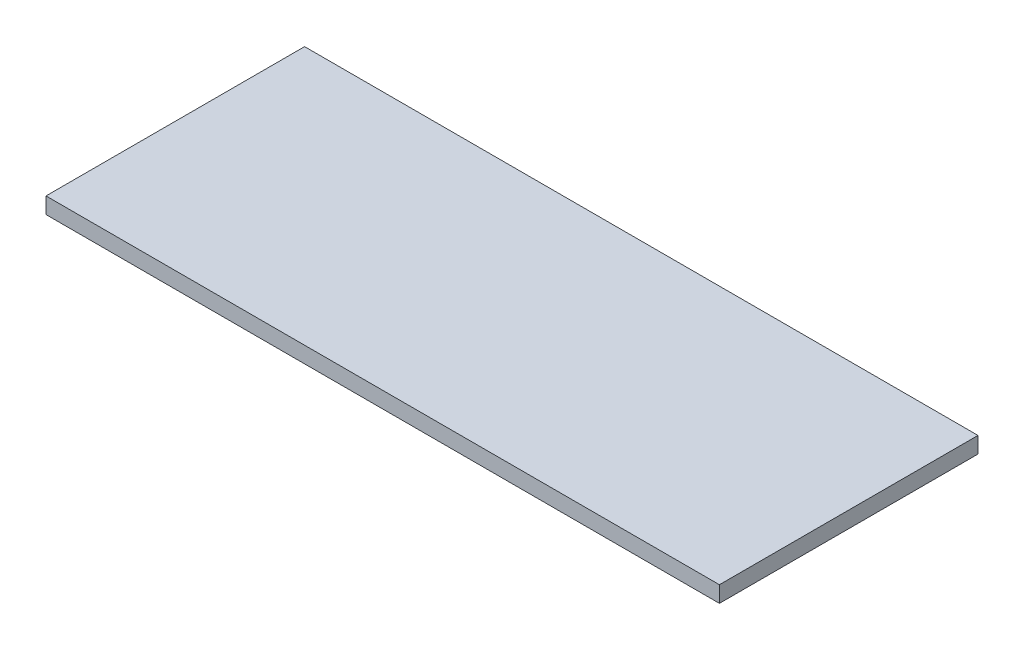
ISO-10303-21;
HEADER;
FILE_DESCRIPTION(('STEP AP214'),'2;1');
FILE_NAME('part.step','',(''),(''),'','','');
FILE_SCHEMA(('AUTOMOTIVE_DESIGN { 1 0 10303 214 1 1 1 1 }'));
ENDSEC;
DATA;
#1=APPLICATION_CONTEXT('core data for automotive mechanical design processes');
#2=APPLICATION_PROTOCOL_DEFINITION('international standard','automotive_design',2000,#1);
#3=PRODUCT_CONTEXT('',#1,'mechanical');
#4=PRODUCT('Part','Part','',(#3));
#5=PRODUCT_RELATED_PRODUCT_CATEGORY('part','',(#4));
#6=PRODUCT_DEFINITION_FORMATION('','',#4);
#7=PRODUCT_DEFINITION_CONTEXT('part definition',#1,'design');
#8=PRODUCT_DEFINITION('design','',#6,#7);
#9=PRODUCT_DEFINITION_SHAPE('','',#8);
#10=(LENGTH_UNIT() NAMED_UNIT(*) SI_UNIT(.MILLI.,.METRE.));
#11=(NAMED_UNIT(*) PLANE_ANGLE_UNIT() SI_UNIT($,.RADIAN.));
#12=(NAMED_UNIT(*) SI_UNIT($,.STERADIAN.) SOLID_ANGLE_UNIT());
#13=UNCERTAINTY_MEASURE_WITH_UNIT(LENGTH_MEASURE(1.E-05),#10,'distance_accuracy_value','');
#14=(GEOMETRIC_REPRESENTATION_CONTEXT(3) GLOBAL_UNCERTAINTY_ASSIGNED_CONTEXT((#13)) GLOBAL_UNIT_ASSIGNED_CONTEXT((#10,
#11,#12)) REPRESENTATION_CONTEXT('',''));
#15=CARTESIAN_POINT('',(0.,0.,0.));
#16=DIRECTION('',(0.,0.,1.));
#17=DIRECTION('',(1.,0.,0.));
#18=AXIS2_PLACEMENT_3D('',#15,#16,#17);
#19=CARTESIAN_POINT('',(62.5,3.,24.));
#20=DIRECTION('',(-1.,0.,0.));
#21=DIRECTION('',(0.,0.,1.));
#22=AXIS2_PLACEMENT_3D('',#19,#20,#21);
#23=PLANE('',#22);
#24=DIRECTION('',(0.,0.,-1.));
#25=VECTOR('',#24,1.);
#26=CARTESIAN_POINT('',(62.5,0.,24.));
#27=LINE('',#26,#25);
#28=CARTESIAN_POINT('',(62.5,0.,24.));
#29=VERTEX_POINT('',#28);
#30=CARTESIAN_POINT('',(62.5,0.,-24.));
#31=VERTEX_POINT('',#30);
#32=EDGE_CURVE('E101',#29,#31,#27,.T.);
#33=ORIENTED_EDGE('',*,*,#32,.T.);
#34=DIRECTION('',(0.,-1.,0.));
#35=VECTOR('',#34,1.);
#36=CARTESIAN_POINT('',(62.5,3.,-24.));
#37=LINE('',#36,#35);
#38=CARTESIAN_POINT('',(62.5,3.,-24.));
#39=VERTEX_POINT('',#38);
#40=EDGE_CURVE('E11',#39,#31,#37,.T.);
#41=ORIENTED_EDGE('',*,*,#40,.F.);
#42=DIRECTION('',(0.,0.,-1.));
#43=VECTOR('',#42,1.);
#44=CARTESIAN_POINT('',(62.5,3.,24.));
#45=LINE('',#44,#43);
#46=CARTESIAN_POINT('',(62.5,3.,24.));
#47=VERTEX_POINT('',#46);
#48=EDGE_CURVE('E89',#47,#39,#45,.T.);
#49=ORIENTED_EDGE('',*,*,#48,.F.);
#50=DIRECTION('',(0.,-1.,0.));
#51=VECTOR('',#50,1.);
#52=CARTESIAN_POINT('',(62.5,3.,24.));
#53=LINE('',#52,#51);
#54=EDGE_CURVE('E97',#47,#29,#53,.T.);
#55=ORIENTED_EDGE('',*,*,#54,.T.);
#56=EDGE_LOOP('',(#33,#41,#49,#55));
#57=FACE_BOUND('',#56,.T.);
#58=ADVANCED_FACE('F38',(#57),#23,.F.);
#59=CARTESIAN_POINT('',(-62.5,3.,-24.));
#60=DIRECTION('',(0.,0.,1.));
#61=DIRECTION('',(1.,0.,0.));
#62=AXIS2_PLACEMENT_3D('',#59,#60,#61);
#63=PLANE('',#62);
#64=DIRECTION('',(-1.,0.,0.));
#65=VECTOR('',#64,1.);
#66=CARTESIAN_POINT('',(-62.5,0.,-24.));
#67=LINE('',#66,#65);
#68=CARTESIAN_POINT('',(-62.5,0.,-24.));
#69=VERTEX_POINT('',#68);
#70=EDGE_CURVE('E93',#31,#69,#67,.T.);
#71=ORIENTED_EDGE('',*,*,#70,.T.);
#72=DIRECTION('',(0.,-1.,0.));
#73=VECTOR('',#72,1.);
#74=CARTESIAN_POINT('',(-62.5,3.,-24.));
#75=LINE('',#74,#73);
#76=CARTESIAN_POINT('',(-62.5,3.,-24.));
#77=VERTEX_POINT('',#76);
#78=EDGE_CURVE('E46',#77,#69,#75,.T.);
#79=ORIENTED_EDGE('',*,*,#78,.F.);
#80=DIRECTION('',(-1.,0.,0.));
#81=VECTOR('',#80,1.);
#82=CARTESIAN_POINT('',(-62.5,3.,-24.));
#83=LINE('',#82,#81);
#84=EDGE_CURVE('E84',#39,#77,#83,.T.);
#85=ORIENTED_EDGE('',*,*,#84,.F.);
#86=ORIENTED_EDGE('',*,*,#40,.T.);
#87=EDGE_LOOP('',(#71,#79,#85,#86));
#88=FACE_BOUND('',#87,.T.);
#89=ADVANCED_FACE('F92',(#88),#63,.F.);
#90=CARTESIAN_POINT('',(-62.5,3.,24.));
#91=DIRECTION('',(1.,0.,0.));
#92=DIRECTION('',(0.,0.,-1.));
#93=AXIS2_PLACEMENT_3D('',#90,#91,#92);
#94=PLANE('',#93);
#95=DIRECTION('',(0.,0.,1.));
#96=VECTOR('',#95,1.);
#97=CARTESIAN_POINT('',(-62.5,0.,24.));
#98=LINE('',#97,#96);
#99=CARTESIAN_POINT('',(-62.5,0.,24.));
#100=VERTEX_POINT('',#99);
#101=EDGE_CURVE('E71',#69,#100,#98,.T.);
#102=ORIENTED_EDGE('',*,*,#101,.T.);
#103=DIRECTION('',(0.,-1.,0.));
#104=VECTOR('',#103,1.);
#105=CARTESIAN_POINT('',(-62.5,3.,24.));
#106=LINE('',#105,#104);
#107=CARTESIAN_POINT('',(-62.5,3.,24.));
#108=VERTEX_POINT('',#107);
#109=EDGE_CURVE('E94',#108,#100,#106,.T.);
#110=ORIENTED_EDGE('',*,*,#109,.F.);
#111=DIRECTION('',(0.,0.,1.));
#112=VECTOR('',#111,1.);
#113=CARTESIAN_POINT('',(-62.5,3.,24.));
#114=LINE('',#113,#112);
#115=EDGE_CURVE('E87',#77,#108,#114,.T.);
#116=ORIENTED_EDGE('',*,*,#115,.F.);
#117=ORIENTED_EDGE('',*,*,#78,.T.);
#118=EDGE_LOOP('',(#102,#110,#116,#117));
#119=FACE_BOUND('',#118,.T.);
#120=ADVANCED_FACE('F95',(#119),#94,.F.);
#121=CARTESIAN_POINT('',(-62.5,3.,24.));
#122=DIRECTION('',(0.,0.,-1.));
#123=DIRECTION('',(-1.,0.,0.));
#124=AXIS2_PLACEMENT_3D('',#121,#122,#123);
#125=PLANE('',#124);
#126=DIRECTION('',(1.,0.,0.));
#127=VECTOR('',#126,1.);
#128=CARTESIAN_POINT('',(-62.5,0.,24.));
#129=LINE('',#128,#127);
#130=EDGE_CURVE('E77',#100,#29,#129,.T.);
#131=ORIENTED_EDGE('',*,*,#130,.T.);
#132=ORIENTED_EDGE('',*,*,#54,.F.);
#133=DIRECTION('',(1.,0.,0.));
#134=VECTOR('',#133,1.);
#135=CARTESIAN_POINT('',(-62.5,3.,24.));
#136=LINE('',#135,#134);
#137=EDGE_CURVE('E54',#108,#47,#136,.T.);
#138=ORIENTED_EDGE('',*,*,#137,.F.);
#139=ORIENTED_EDGE('',*,*,#109,.T.);
#140=EDGE_LOOP('',(#131,#132,#138,#139));
#141=FACE_BOUND('',#140,.T.);
#142=ADVANCED_FACE('F108',(#141),#125,.F.);
#143=CARTESIAN_POINT('',(0.,3.,0.));
#144=DIRECTION('',(0.,-1.,0.));
#145=DIRECTION('',(0.,0.,-1.));
#146=AXIS2_PLACEMENT_3D('',#143,#144,#145);
#147=PLANE('',#146);
#148=ORIENTED_EDGE('',*,*,#48,.T.);
#149=ORIENTED_EDGE('',*,*,#84,.T.);
#150=ORIENTED_EDGE('',*,*,#115,.T.);
#151=ORIENTED_EDGE('',*,*,#137,.T.);
#152=EDGE_LOOP('',(#148,#149,#150,#151));
#153=FACE_BOUND('',#152,.T.);
#154=ADVANCED_FACE('F85',(#153),#147,.F.);
#155=CARTESIAN_POINT('',(0.,0.,0.));
#156=DIRECTION('',(0.,-1.,0.));
#157=DIRECTION('',(0.,0.,-1.));
#158=AXIS2_PLACEMENT_3D('',#155,#156,#157);
#159=PLANE('',#158);
#160=ORIENTED_EDGE('',*,*,#32,.F.);
#161=ORIENTED_EDGE('',*,*,#130,.F.);
#162=ORIENTED_EDGE('',*,*,#101,.F.);
#163=ORIENTED_EDGE('',*,*,#70,.F.);
#164=EDGE_LOOP('',(#160,#161,#162,#163));
#165=FACE_BOUND('',#164,.T.);
#166=ADVANCED_FACE('F111',(#165),#159,.T.);
#167=CLOSED_SHELL('',(#58,#89,#120,#142,#154,#166));
#168=MANIFOLD_SOLID_BREP('B2',#167);
#169=ADVANCED_BREP_SHAPE_REPRESENTATION('',(#18,#168),#14);
#170=SHAPE_DEFINITION_REPRESENTATION(#9,#169);
ENDSEC;
END-ISO-10303-21;
